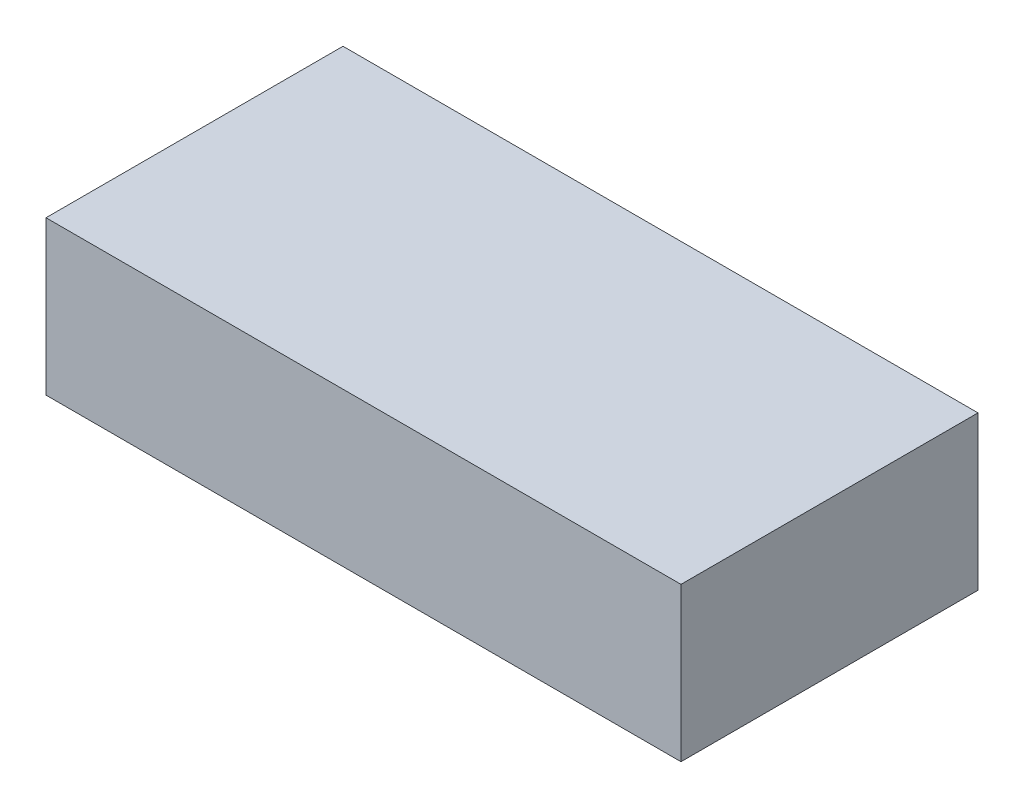
ISO-10303-21;
HEADER;
FILE_DESCRIPTION(('STEP AP214'),'2;1');
FILE_NAME('part.step','',(''),(''),'','','');
FILE_SCHEMA(('AUTOMOTIVE_DESIGN { 1 0 10303 214 1 1 1 1 }'));
ENDSEC;
DATA;
#1=APPLICATION_CONTEXT('core data for automotive mechanical design processes');
#2=APPLICATION_PROTOCOL_DEFINITION('international standard','automotive_design',2000,#1);
#3=PRODUCT_CONTEXT('',#1,'mechanical');
#4=PRODUCT('Part','Part','',(#3));
#5=PRODUCT_RELATED_PRODUCT_CATEGORY('part','',(#4));
#6=PRODUCT_DEFINITION_FORMATION('','',#4);
#7=PRODUCT_DEFINITION_CONTEXT('part definition',#1,'design');
#8=PRODUCT_DEFINITION('design','',#6,#7);
#9=PRODUCT_DEFINITION_SHAPE('','',#8);
#10=(LENGTH_UNIT() NAMED_UNIT(*) SI_UNIT(.MILLI.,.METRE.));
#11=(NAMED_UNIT(*) PLANE_ANGLE_UNIT() SI_UNIT($,.RADIAN.));
#12=(NAMED_UNIT(*) SI_UNIT($,.STERADIAN.) SOLID_ANGLE_UNIT());
#13=UNCERTAINTY_MEASURE_WITH_UNIT(LENGTH_MEASURE(1.E-05),#10,'distance_accuracy_value','');
#14=(GEOMETRIC_REPRESENTATION_CONTEXT(3) GLOBAL_UNCERTAINTY_ASSIGNED_CONTEXT((#13)) GLOBAL_UNIT_ASSIGNED_CONTEXT((#10,
#11,#12)) REPRESENTATION_CONTEXT('',''));
#15=CARTESIAN_POINT('',(0.,0.,0.));
#16=DIRECTION('',(0.,0.,1.));
#17=DIRECTION('',(1.,0.,0.));
#18=AXIS2_PLACEMENT_3D('',#15,#16,#17);
#19=CARTESIAN_POINT('',(0.,15.,0.));
#20=DIRECTION('',(1.,0.,0.));
#21=DIRECTION('',(0.,0.,-1.));
#22=AXIS2_PLACEMENT_3D('',#19,#20,#21);
#23=PLANE('',#22);
#24=DIRECTION('',(0.,0.,1.));
#25=VECTOR('',#24,1.);
#26=CARTESIAN_POINT('',(0.,0.,0.));
#27=LINE('',#26,#25);
#28=CARTESIAN_POINT('',(0.,0.,-29.));
#29=VERTEX_POINT('',#28);
#30=CARTESIAN_POINT('',(0.,0.,0.));
#31=VERTEX_POINT('',#30);
#32=EDGE_CURVE('E98',#29,#31,#27,.T.);
#33=ORIENTED_EDGE('',*,*,#32,.T.);
#34=DIRECTION('',(0.,-1.,0.));
#35=VECTOR('',#34,1.);
#36=CARTESIAN_POINT('',(0.,15.,0.));
#37=LINE('',#36,#35);
#38=CARTESIAN_POINT('',(0.,15.,0.));
#39=VERTEX_POINT('',#38);
#40=EDGE_CURVE('E11',#39,#31,#37,.T.);
#41=ORIENTED_EDGE('',*,*,#40,.F.);
#42=DIRECTION('',(0.,0.,1.));
#43=VECTOR('',#42,1.);
#44=CARTESIAN_POINT('',(0.,15.,0.));
#45=LINE('',#44,#43);
#46=CARTESIAN_POINT('',(0.,15.,-29.));
#47=VERTEX_POINT('',#46);
#48=EDGE_CURVE('E86',#47,#39,#45,.T.);
#49=ORIENTED_EDGE('',*,*,#48,.F.);
#50=DIRECTION('',(0.,-1.,0.));
#51=VECTOR('',#50,1.);
#52=CARTESIAN_POINT('',(0.,15.,-29.));
#53=LINE('',#52,#51);
#54=EDGE_CURVE('E94',#47,#29,#53,.T.);
#55=ORIENTED_EDGE('',*,*,#54,.T.);
#56=EDGE_LOOP('',(#33,#41,#49,#55));
#57=FACE_BOUND('',#56,.T.);
#58=ADVANCED_FACE('F35',(#57),#23,.F.);
#59=CARTESIAN_POINT('',(0.,15.,0.));
#60=DIRECTION('',(0.,0.,-1.));
#61=DIRECTION('',(-1.,0.,0.));
#62=AXIS2_PLACEMENT_3D('',#59,#60,#61);
#63=PLANE('',#62);
#64=DIRECTION('',(1.,0.,0.));
#65=VECTOR('',#64,1.);
#66=CARTESIAN_POINT('',(0.,0.,0.));
#67=LINE('',#66,#65);
#68=CARTESIAN_POINT('',(62.,0.,0.));
#69=VERTEX_POINT('',#68);
#70=EDGE_CURVE('E90',#31,#69,#67,.T.);
#71=ORIENTED_EDGE('',*,*,#70,.T.);
#72=DIRECTION('',(0.,-1.,0.));
#73=VECTOR('',#72,1.);
#74=CARTESIAN_POINT('',(62.,15.,0.));
#75=LINE('',#74,#73);
#76=CARTESIAN_POINT('',(62.,15.,0.));
#77=VERTEX_POINT('',#76);
#78=EDGE_CURVE('E43',#77,#69,#75,.T.);
#79=ORIENTED_EDGE('',*,*,#78,.F.);
#80=DIRECTION('',(1.,0.,0.));
#81=VECTOR('',#80,1.);
#82=CARTESIAN_POINT('',(0.,15.,0.));
#83=LINE('',#82,#81);
#84=EDGE_CURVE('E81',#39,#77,#83,.T.);
#85=ORIENTED_EDGE('',*,*,#84,.F.);
#86=ORIENTED_EDGE('',*,*,#40,.T.);
#87=EDGE_LOOP('',(#71,#79,#85,#86));
#88=FACE_BOUND('',#87,.T.);
#89=ADVANCED_FACE('F89',(#88),#63,.F.);
#90=CARTESIAN_POINT('',(62.,15.,0.));
#91=DIRECTION('',(-1.,0.,0.));
#92=DIRECTION('',(0.,0.,1.));
#93=AXIS2_PLACEMENT_3D('',#90,#91,#92);
#94=PLANE('',#93);
#95=DIRECTION('',(0.,0.,-1.));
#96=VECTOR('',#95,1.);
#97=CARTESIAN_POINT('',(62.,0.,0.));
#98=LINE('',#97,#96);
#99=CARTESIAN_POINT('',(62.,0.,-29.));
#100=VERTEX_POINT('',#99);
#101=EDGE_CURVE('E68',#69,#100,#98,.T.);
#102=ORIENTED_EDGE('',*,*,#101,.T.);
#103=DIRECTION('',(0.,-1.,0.));
#104=VECTOR('',#103,1.);
#105=CARTESIAN_POINT('',(62.,15.,-29.));
#106=LINE('',#105,#104);
#107=CARTESIAN_POINT('',(62.,15.,-29.));
#108=VERTEX_POINT('',#107);
#109=EDGE_CURVE('E91',#108,#100,#106,.T.);
#110=ORIENTED_EDGE('',*,*,#109,.F.);
#111=DIRECTION('',(0.,0.,-1.));
#112=VECTOR('',#111,1.);
#113=CARTESIAN_POINT('',(62.,15.,0.));
#114=LINE('',#113,#112);
#115=EDGE_CURVE('E84',#77,#108,#114,.T.);
#116=ORIENTED_EDGE('',*,*,#115,.F.);
#117=ORIENTED_EDGE('',*,*,#78,.T.);
#118=EDGE_LOOP('',(#102,#110,#116,#117));
#119=FACE_BOUND('',#118,.T.);
#120=ADVANCED_FACE('F92',(#119),#94,.F.);
#121=CARTESIAN_POINT('',(0.,15.,-29.));
#122=DIRECTION('',(0.,0.,1.));
#123=DIRECTION('',(1.,0.,0.));
#124=AXIS2_PLACEMENT_3D('',#121,#122,#123);
#125=PLANE('',#124);
#126=DIRECTION('',(-1.,0.,0.));
#127=VECTOR('',#126,1.);
#128=CARTESIAN_POINT('',(0.,0.,-29.));
#129=LINE('',#128,#127);
#130=EDGE_CURVE('E74',#100,#29,#129,.T.);
#131=ORIENTED_EDGE('',*,*,#130,.T.);
#132=ORIENTED_EDGE('',*,*,#54,.F.);
#133=DIRECTION('',(-1.,0.,0.));
#134=VECTOR('',#133,1.);
#135=CARTESIAN_POINT('',(0.,15.,-29.));
#136=LINE('',#135,#134);
#137=EDGE_CURVE('E51',#108,#47,#136,.T.);
#138=ORIENTED_EDGE('',*,*,#137,.F.);
#139=ORIENTED_EDGE('',*,*,#109,.T.);
#140=EDGE_LOOP('',(#131,#132,#138,#139));
#141=FACE_BOUND('',#140,.T.);
#142=ADVANCED_FACE('F105',(#141),#125,.F.);
#143=CARTESIAN_POINT('',(0.,15.,0.));
#144=DIRECTION('',(0.,-1.,0.));
#145=DIRECTION('',(0.,0.,-1.));
#146=AXIS2_PLACEMENT_3D('',#143,#144,#145);
#147=PLANE('',#146);
#148=ORIENTED_EDGE('',*,*,#48,.T.);
#149=ORIENTED_EDGE('',*,*,#84,.T.);
#150=ORIENTED_EDGE('',*,*,#115,.T.);
#151=ORIENTED_EDGE('',*,*,#137,.T.);
#152=EDGE_LOOP('',(#148,#149,#150,#151));
#153=FACE_BOUND('',#152,.T.);
#154=ADVANCED_FACE('F82',(#153),#147,.F.);
#155=CARTESIAN_POINT('',(0.,0.,0.));
#156=DIRECTION('',(0.,-1.,0.));
#157=DIRECTION('',(0.,0.,-1.));
#158=AXIS2_PLACEMENT_3D('',#155,#156,#157);
#159=PLANE('',#158);
#160=ORIENTED_EDGE('',*,*,#32,.F.);
#161=ORIENTED_EDGE('',*,*,#130,.F.);
#162=ORIENTED_EDGE('',*,*,#101,.F.);
#163=ORIENTED_EDGE('',*,*,#70,.F.);
#164=EDGE_LOOP('',(#160,#161,#162,#163));
#165=FACE_BOUND('',#164,.T.);
#166=ADVANCED_FACE('F108',(#165),#159,.T.);
#167=CLOSED_SHELL('',(#58,#89,#120,#142,#154,#166));
#168=MANIFOLD_SOLID_BREP('B2',#167);
#169=ADVANCED_BREP_SHAPE_REPRESENTATION('',(#18,#168),#14);
#170=SHAPE_DEFINITION_REPRESENTATION(#9,#169);
ENDSEC;
END-ISO-10303-21;
